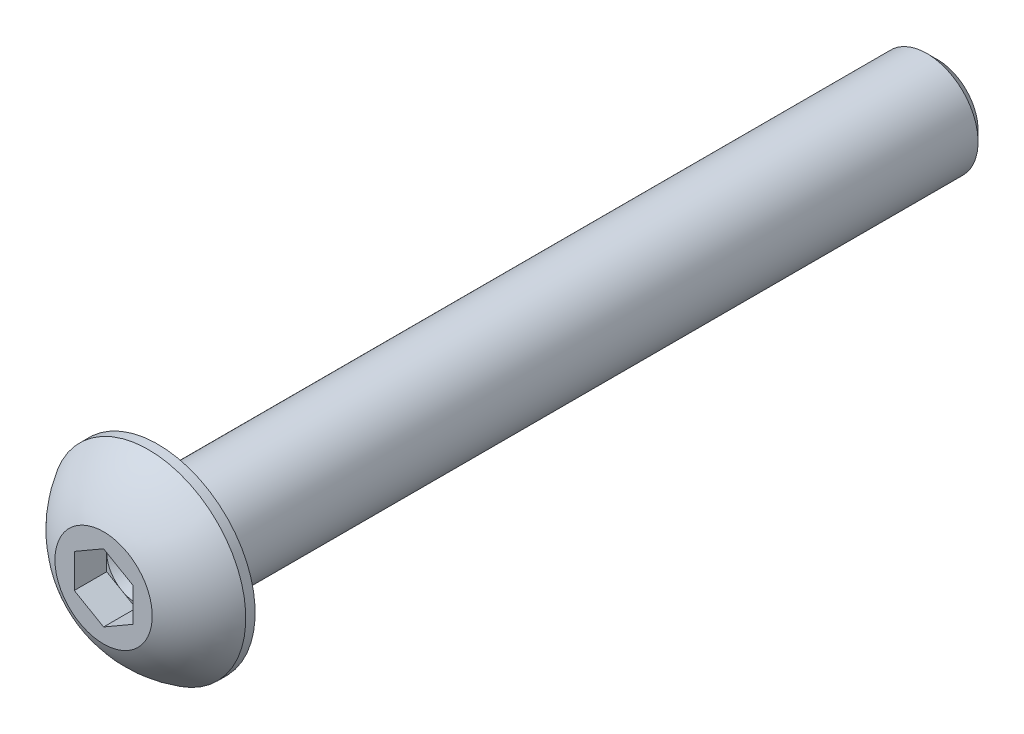
ISO-10303-21;
HEADER;
FILE_DESCRIPTION(('STEP AP214'),'2;1');
FILE_NAME('part.step','',(''),(''),'','','');
FILE_SCHEMA(('AUTOMOTIVE_DESIGN { 1 0 10303 214 1 1 1 1 }'));
ENDSEC;
DATA;
#1=APPLICATION_CONTEXT('core data for automotive mechanical design processes');
#2=APPLICATION_PROTOCOL_DEFINITION('international standard','automotive_design',2000,#1);
#3=PRODUCT_CONTEXT('',#1,'mechanical');
#4=PRODUCT('Part','Part','',(#3));
#5=PRODUCT_RELATED_PRODUCT_CATEGORY('part','',(#4));
#6=PRODUCT_DEFINITION_FORMATION('','',#4);
#7=PRODUCT_DEFINITION_CONTEXT('part definition',#1,'design');
#8=PRODUCT_DEFINITION('design','',#6,#7);
#9=PRODUCT_DEFINITION_SHAPE('','',#8);
#10=(LENGTH_UNIT() NAMED_UNIT(*) SI_UNIT(.MILLI.,.METRE.));
#11=(NAMED_UNIT(*) PLANE_ANGLE_UNIT() SI_UNIT($,.RADIAN.));
#12=(NAMED_UNIT(*) SI_UNIT($,.STERADIAN.) SOLID_ANGLE_UNIT());
#13=UNCERTAINTY_MEASURE_WITH_UNIT(LENGTH_MEASURE(1.E-05),#10,'distance_accuracy_value','');
#14=(GEOMETRIC_REPRESENTATION_CONTEXT(3) GLOBAL_UNCERTAINTY_ASSIGNED_CONTEXT((#13)) GLOBAL_UNIT_ASSIGNED_CONTEXT((#10,
#11,#12)) REPRESENTATION_CONTEXT('',''));
#15=CARTESIAN_POINT('',(0.,0.,0.));
#16=DIRECTION('',(0.,0.,1.));
#17=DIRECTION('',(1.,0.,0.));
#18=AXIS2_PLACEMENT_3D('',#15,#16,#17);
#19=CARTESIAN_POINT('',(0.,0.,-1.3208));
#20=DIRECTION('',(0.,0.,1.));
#21=DIRECTION('',(1.,0.,0.));
#22=AXIS2_PLACEMENT_3D('',#19,#20,#21);
#23=PLANE('',#22);
#24=CARTESIAN_POINT('',(0.,0.,-1.3208));
#25=DIRECTION('',(0.,0.,1.));
#26=DIRECTION('',(1.,0.,0.));
#27=AXIS2_PLACEMENT_3D('',#24,#25,#26);
#28=CIRCLE('',#27,1.1938);
#29=CARTESIAN_POINT('',(1.1938,0.,-1.3208));
#30=VERTEX_POINT('',#29);
#31=CARTESIAN_POINT('',(0.5969,1.03386112703786,-1.3208));
#32=VERTEX_POINT('',#31);
#33=EDGE_CURVE('E95',#30,#32,#28,.T.);
#34=ORIENTED_EDGE('',*,*,#33,.F.);
#35=DIRECTION('',(0.,-1.,0.));
#36=VECTOR('',#35,1.);
#37=CARTESIAN_POINT('',(1.1938,0.,-1.3208));
#38=LINE('',#37,#36);
#39=CARTESIAN_POINT('',(1.1938,0.689240751358576,-1.3208));
#40=VERTEX_POINT('',#39);
#41=EDGE_CURVE('E117',#40,#30,#38,.T.);
#42=ORIENTED_EDGE('',*,*,#41,.F.);
#43=DIRECTION('',(0.866025403784438,-0.5,0.));
#44=VECTOR('',#43,1.);
#45=CARTESIAN_POINT('',(0.5969,1.03386112703786,-1.3208));
#46=LINE('',#45,#44);
#47=EDGE_CURVE('E115',#32,#40,#46,.T.);
#48=ORIENTED_EDGE('',*,*,#47,.F.);
#49=EDGE_LOOP('',(#34,#42,#48));
#50=FACE_BOUND('',#49,.T.);
#51=ADVANCED_FACE('F17',(#50),#23,.T.);
#52=CARTESIAN_POINT('',(-0.5969,1.03386112703786,-1.3208));
#53=VERTEX_POINT('',#52);
#54=EDGE_CURVE('E97',#32,#53,#28,.T.);
#55=ORIENTED_EDGE('',*,*,#54,.F.);
#56=CARTESIAN_POINT('',(0.,1.37848150271715,-1.3208));
#57=VERTEX_POINT('',#56);
#58=EDGE_CURVE('E111',#57,#32,#46,.T.);
#59=ORIENTED_EDGE('',*,*,#58,.F.);
#60=DIRECTION('',(0.866025403784437,0.5,0.));
#61=VECTOR('',#60,1.);
#62=CARTESIAN_POINT('',(-0.5969,1.03386112703786,-1.3208));
#63=LINE('',#62,#61);
#64=EDGE_CURVE('E112',#53,#57,#63,.T.);
#65=ORIENTED_EDGE('',*,*,#64,.F.);
#66=EDGE_LOOP('',(#55,#59,#65));
#67=FACE_BOUND('',#66,.T.);
#68=ADVANCED_FACE('F109',(#67),#23,.T.);
#69=CARTESIAN_POINT('',(-1.1938,0.,-1.3208));
#70=VERTEX_POINT('',#69);
#71=EDGE_CURVE('E114',#53,#70,#28,.T.);
#72=ORIENTED_EDGE('',*,*,#71,.F.);
#73=CARTESIAN_POINT('',(-1.1938,0.689240751358572,-1.3208));
#74=VERTEX_POINT('',#73);
#75=EDGE_CURVE('E126',#74,#53,#63,.T.);
#76=ORIENTED_EDGE('',*,*,#75,.F.);
#77=DIRECTION('',(0.,1.,0.));
#78=VECTOR('',#77,1.);
#79=CARTESIAN_POINT('',(-1.1938,0.,-1.3208));
#80=LINE('',#79,#78);
#81=EDGE_CURVE('E129',#70,#74,#80,.T.);
#82=ORIENTED_EDGE('',*,*,#81,.F.);
#83=EDGE_LOOP('',(#72,#76,#82));
#84=FACE_BOUND('',#83,.T.);
#85=ADVANCED_FACE('F198',(#84),#23,.T.);
#86=CARTESIAN_POINT('',(-0.5969,-1.03386112703786,-1.3208));
#87=VERTEX_POINT('',#86);
#88=EDGE_CURVE('E224',#70,#87,#28,.T.);
#89=ORIENTED_EDGE('',*,*,#88,.F.);
#90=CARTESIAN_POINT('',(-1.1938,-0.689240751358575,-1.3208));
#91=VERTEX_POINT('',#90);
#92=EDGE_CURVE('E130',#91,#70,#80,.T.);
#93=ORIENTED_EDGE('',*,*,#92,.F.);
#94=DIRECTION('',(-0.866025403784438,0.5,0.));
#95=VECTOR('',#94,1.);
#96=CARTESIAN_POINT('',(-0.5969,-1.03386112703786,-1.3208));
#97=LINE('',#96,#95);
#98=EDGE_CURVE('E133',#87,#91,#97,.T.);
#99=ORIENTED_EDGE('',*,*,#98,.F.);
#100=EDGE_LOOP('',(#89,#93,#99));
#101=FACE_BOUND('',#100,.T.);
#102=ADVANCED_FACE('F211',(#101),#23,.T.);
#103=CARTESIAN_POINT('',(0.5969,-1.03386112703786,-1.3208));
#104=VERTEX_POINT('',#103);
#105=EDGE_CURVE('E32',#87,#104,#28,.T.);
#106=ORIENTED_EDGE('',*,*,#105,.F.);
#107=CARTESIAN_POINT('',(0.,-1.37848150271715,-1.3208));
#108=VERTEX_POINT('',#107);
#109=EDGE_CURVE('E134',#108,#87,#97,.T.);
#110=ORIENTED_EDGE('',*,*,#109,.F.);
#111=DIRECTION('',(-0.866025403784437,-0.5,0.));
#112=VECTOR('',#111,1.);
#113=CARTESIAN_POINT('',(0.5969,-1.03386112703786,-1.3208));
#114=LINE('',#113,#112);
#115=EDGE_CURVE('E137',#104,#108,#114,.T.);
#116=ORIENTED_EDGE('',*,*,#115,.F.);
#117=EDGE_LOOP('',(#106,#110,#116));
#118=FACE_BOUND('',#117,.T.);
#119=ADVANCED_FACE('F203',(#118),#23,.T.);
#120=CARTESIAN_POINT('',(-0.9906,0.,0.));
#121=DIRECTION('',(0.,0.,1.));
#122=DIRECTION('',(1.,0.,0.));
#123=AXIS2_PLACEMENT_3D('',#120,#121,#122);
#124=PLANE('',#123);
#125=CARTESIAN_POINT('',(0.,0.,0.));
#126=DIRECTION('',(0.,0.,-1.));
#127=DIRECTION('',(-1.,0.,0.));
#128=AXIS2_PLACEMENT_3D('',#125,#126,#127);
#129=CIRCLE('',#128,1.9812);
#130=CARTESIAN_POINT('',(-1.9812,0.,0.));
#131=VERTEX_POINT('',#130);
#132=EDGE_CURVE('E171',#131,#131,#129,.T.);
#133=ORIENTED_EDGE('',*,*,#132,.F.);
#134=EDGE_LOOP('',(#133));
#135=FACE_BOUND('',#134,.T.);
#136=DIRECTION('',(0.866025403784437,0.5,0.));
#137=VECTOR('',#136,1.);
#138=CARTESIAN_POINT('',(-0.5969,1.03386112703786,0.));
#139=LINE('',#138,#137);
#140=CARTESIAN_POINT('',(-1.1938,0.689240751358572,0.));
#141=VERTEX_POINT('',#140);
#142=CARTESIAN_POINT('',(0.,1.37848150271715,0.));
#143=VERTEX_POINT('',#142);
#144=EDGE_CURVE('E146',#141,#143,#139,.T.);
#145=ORIENTED_EDGE('',*,*,#144,.T.);
#146=DIRECTION('',(0.866025403784438,-0.5,0.));
#147=VECTOR('',#146,1.);
#148=CARTESIAN_POINT('',(0.5969,1.03386112703786,0.));
#149=LINE('',#148,#147);
#150=CARTESIAN_POINT('',(1.1938,0.689240751358576,0.));
#151=VERTEX_POINT('',#150);
#152=EDGE_CURVE('E104',#143,#151,#149,.T.);
#153=ORIENTED_EDGE('',*,*,#152,.T.);
#154=DIRECTION('',(0.,-1.,0.));
#155=VECTOR('',#154,1.);
#156=CARTESIAN_POINT('',(1.1938,0.,0.));
#157=LINE('',#156,#155);
#158=CARTESIAN_POINT('',(1.1938,-0.689240751358576,0.));
#159=VERTEX_POINT('',#158);
#160=EDGE_CURVE('E120',#151,#159,#157,.T.);
#161=ORIENTED_EDGE('',*,*,#160,.T.);
#162=DIRECTION('',(-0.866025403784437,-0.5,0.));
#163=VECTOR('',#162,1.);
#164=CARTESIAN_POINT('',(0.5969,-1.03386112703786,0.));
#165=LINE('',#164,#163);
#166=CARTESIAN_POINT('',(0.,-1.37848150271715,0.));
#167=VERTEX_POINT('',#166);
#168=EDGE_CURVE('E40',#159,#167,#165,.T.);
#169=ORIENTED_EDGE('',*,*,#168,.T.);
#170=DIRECTION('',(-0.866025403784438,0.5,0.));
#171=VECTOR('',#170,1.);
#172=CARTESIAN_POINT('',(-0.5969,-1.03386112703786,0.));
#173=LINE('',#172,#171);
#174=CARTESIAN_POINT('',(-1.1938,-0.689240751358575,0.));
#175=VERTEX_POINT('',#174);
#176=EDGE_CURVE('E152',#167,#175,#173,.T.);
#177=ORIENTED_EDGE('',*,*,#176,.T.);
#178=DIRECTION('',(0.,1.,0.));
#179=VECTOR('',#178,1.);
#180=CARTESIAN_POINT('',(-1.1938,0.,0.));
#181=LINE('',#180,#179);
#182=EDGE_CURVE('E149',#175,#141,#181,.T.);
#183=ORIENTED_EDGE('',*,*,#182,.T.);
#184=EDGE_LOOP('',(#145,#153,#161,#169,#177,#183));
#185=FACE_BOUND('',#184,.T.);
#186=ADVANCED_FACE('F210',(#135,#185),#124,.T.);
#187=CARTESIAN_POINT('',(0.,0.,1.48381805047393));
#188=DIRECTION('',(0.,0.,-1.));
#189=DIRECTION('',(-1.,0.,0.));
#190=AXIS2_PLACEMENT_3D('',#187,#188,#189);
#191=CYLINDRICAL_SURFACE('',#190,3.9624);
#192=CARTESIAN_POINT('',(0.,0.,-1.8288));
#193=DIRECTION('',(0.,0.,-1.));
#194=DIRECTION('',(-1.,0.,0.));
#195=AXIS2_PLACEMENT_3D('',#192,#193,#194);
#196=CIRCLE('',#195,3.9624);
#197=CARTESIAN_POINT('',(-3.9624,0.,-1.8288));
#198=VERTEX_POINT('',#197);
#199=EDGE_CURVE('E168',#198,#198,#196,.T.);
#200=ORIENTED_EDGE('',*,*,#199,.T.);
#201=EDGE_LOOP('',(#200));
#202=FACE_BOUND('',#201,.T.);
#203=CARTESIAN_POINT('',(0.,0.,-2.2098));
#204=DIRECTION('',(0.,0.,-1.));
#205=DIRECTION('',(-1.,0.,0.));
#206=AXIS2_PLACEMENT_3D('',#203,#204,#205);
#207=CIRCLE('',#206,3.9624);
#208=CARTESIAN_POINT('',(-3.9624,0.,-2.2098));
#209=VERTEX_POINT('',#208);
#210=EDGE_CURVE('E180',#209,#209,#207,.T.);
#211=ORIENTED_EDGE('',*,*,#210,.F.);
#212=EDGE_LOOP('',(#211));
#213=FACE_BOUND('',#212,.T.);
#214=ADVANCED_FACE('F217',(#202,#213),#191,.T.);
#215=CARTESIAN_POINT('',(-3.2131,0.,-2.2098));
#216=DIRECTION('',(0.,0.,-1.));
#217=DIRECTION('',(-1.,0.,0.));
#218=AXIS2_PLACEMENT_3D('',#215,#216,#217);
#219=PLANE('',#218);
#220=ORIENTED_EDGE('',*,*,#210,.T.);
#221=EDGE_LOOP('',(#220));
#222=FACE_BOUND('',#221,.T.);
#223=CARTESIAN_POINT('',(0.,0.,-2.2098));
#224=DIRECTION('',(0.,0.,-1.));
#225=DIRECTION('',(-1.,0.,0.));
#226=AXIS2_PLACEMENT_3D('',#223,#224,#225);
#227=CIRCLE('',#226,2.4638);
#228=CARTESIAN_POINT('',(-2.4638,0.,-2.2098));
#229=VERTEX_POINT('',#228);
#230=EDGE_CURVE('E177',#229,#229,#227,.T.);
#231=ORIENTED_EDGE('',*,*,#230,.F.);
#232=EDGE_LOOP('',(#231));
#233=FACE_BOUND('',#232,.T.);
#234=ADVANCED_FACE('F270',(#222,#233),#219,.T.);
#235=CARTESIAN_POINT('',(0.,0.,-2.5908));
#236=DIRECTION('',(0.,0.,-1.));
#237=DIRECTION('',(-1.,0.,0.));
#238=AXIS2_PLACEMENT_3D('',#235,#236,#237);
#239=TOROIDAL_SURFACE('',#238,2.4638,0.381);
#240=ORIENTED_EDGE('',*,*,#230,.T.);
#241=EDGE_LOOP('',(#240));
#242=FACE_BOUND('',#241,.T.);
#243=CARTESIAN_POINT('',(0.,0.,-2.5908));
#244=DIRECTION('',(0.,0.,-1.));
#245=DIRECTION('',(-1.,0.,0.));
#246=AXIS2_PLACEMENT_3D('',#243,#244,#245);
#247=CIRCLE('',#246,2.0828);
#248=CARTESIAN_POINT('',(-2.0828,0.,-2.5908));
#249=VERTEX_POINT('',#248);
#250=EDGE_CURVE('E174',#249,#249,#247,.T.);
#251=ORIENTED_EDGE('',*,*,#250,.F.);
#252=EDGE_LOOP('',(#251));
#253=FACE_BOUND('',#252,.T.);
#254=ADVANCED_FACE('F266',(#242,#253),#239,.F.);
#255=CARTESIAN_POINT('',(0.,0.,1.48381805047393));
#256=DIRECTION('',(0.,0.,-1.));
#257=DIRECTION('',(-1.,0.,0.));
#258=AXIS2_PLACEMENT_3D('',#255,#256,#257);
#259=CYLINDRICAL_SURFACE('',#258,2.0828);
#260=CARTESIAN_POINT('',(0.,0.,-33.53085761938));
#261=DIRECTION('',(0.,0.,-1.));
#262=DIRECTION('',(-1.,0.,0.));
#263=AXIS2_PLACEMENT_3D('',#260,#261,#262);
#264=CIRCLE('',#263,2.0828);
#265=CARTESIAN_POINT('',(-2.0828,0.,-33.53085761938));
#266=VERTEX_POINT('',#265);
#267=EDGE_CURVE('E11',#266,#266,#264,.F.);
#268=ORIENTED_EDGE('',*,*,#267,.T.);
#269=EDGE_LOOP('',(#268));
#270=FACE_BOUND('',#269,.T.);
#271=ORIENTED_EDGE('',*,*,#250,.T.);
#272=EDGE_LOOP('',(#271));
#273=FACE_BOUND('',#272,.T.);
#274=ADVANCED_FACE('F263',(#270,#273),#259,.T.);
#275=CARTESIAN_POINT('',(-1.0414,0.,-33.9598));
#276=DIRECTION('',(0.,0.,-1.));
#277=DIRECTION('',(-1.,0.,0.));
#278=AXIS2_PLACEMENT_3D('',#275,#276,#277);
#279=PLANE('',#278);
#280=CARTESIAN_POINT('',(0.,0.,-33.9598));
#281=DIRECTION('',(0.,0.,-1.));
#282=DIRECTION('',(-1.,0.,0.));
#283=AXIS2_PLACEMENT_3D('',#280,#281,#282);
#284=CIRCLE('',#283,1.65385761938);
#285=CARTESIAN_POINT('',(-1.65385761938,0.,-33.9598));
#286=VERTEX_POINT('',#285);
#287=EDGE_CURVE('E25',#286,#286,#284,.T.);
#288=ORIENTED_EDGE('',*,*,#287,.T.);
#289=EDGE_LOOP('',(#288));
#290=FACE_BOUND('',#289,.T.);
#291=ADVANCED_FACE('F185',(#290),#279,.T.);
#292=CARTESIAN_POINT('',(0.,0.,-4.13385));
#293=DIRECTION('',(0.,0.,-1.));
#294=DIRECTION('',(-1.,0.,0.));
#295=AXIS2_PLACEMENT_3D('',#292,#293,#294);
#296=SPHERICAL_SURFACE('',#295,4.58408870578439);
#297=CARTESIAN_POINT('',(-3.9624,0.,-1.8288));
#298=CARTESIAN_POINT('',(-3.94806555004249,0.,-1.80415889596803));
#299=CARTESIAN_POINT('',(-3.93350118989005,0.,-1.77965153901308));
#300=CARTESIAN_POINT('',(-3.90391784301183,0.,-1.73091277312732));
#301=CARTESIAN_POINT('',(-3.88889885628605,0.,-1.70668136419653));
#302=CARTESIAN_POINT('',(-3.85841145007764,0.,-1.65850294822928));
#303=CARTESIAN_POINT('',(-3.84294303059502,0.,-1.63455594119281));
#304=CARTESIAN_POINT('',(-3.8115621515089,0.,-1.58695465816593));
#305=CARTESIAN_POINT('',(-3.79564969190541,0.,-1.56330038217551));
#306=CARTESIAN_POINT('',(-3.76338626839824,0.,-1.51629279540493));
#307=CARTESIAN_POINT('',(-3.74703530449455,0.,-1.49293948462476));
#308=CARTESIAN_POINT('',(-3.71390056387007,0.,-1.44654195584239));
#309=CARTESIAN_POINT('',(-3.69711678714927,0.,-1.42349773784017));
#310=CARTESIAN_POINT('',(-3.66312226219548,0.,-1.37772641509887));
#311=CARTESIAN_POINT('',(-3.6459115139625,0.,-1.35499931035979));
#312=CARTESIAN_POINT('',(-3.61106903611232,0.,-1.30987012412818));
#313=CARTESIAN_POINT('',(-3.59343730649512,0.,-1.28746804263567));
#314=CARTESIAN_POINT('',(-3.55775900246558,0.,-1.2429966997941));
#315=CARTESIAN_POINT('',(-3.53971242805323,0.,-1.22092743844506));
#316=CARTESIAN_POINT('',(-3.50321071542199,0.,-1.17712941694205));
#317=CARTESIAN_POINT('',(-3.48475557720311,0.,-1.15540065678809));
#318=CARTESIAN_POINT('',(-3.44744316014101,0.,-1.11229120022037));
#319=CARTESIAN_POINT('',(-3.4285858812978,0.,-1.0909105038066));
#320=CARTESIAN_POINT('',(-3.39047574613265,0.,-1.04850461612249));
#321=CARTESIAN_POINT('',(-3.37122288981071,0.,-1.02747942485214));
#322=CARTESIAN_POINT('',(-3.33232830051141,0.,-0.985791865127185));
#323=CARTESIAN_POINT('',(-3.31268656753406,0.,-0.965129496672575));
#324=CARTESIAN_POINT('',(-3.27302106109312,0.,-0.924174773973387));
#325=CARTESIAN_POINT('',(-3.25299728762955,0.,-0.903882419728808));
#326=CARTESIAN_POINT('',(-3.21257466935193,0.,-0.863674788063108));
#327=CARTESIAN_POINT('',(-3.19217582453788,0.,-0.843759510641986));
#328=CARTESIAN_POINT('',(-3.15101016323603,0.,-0.80431296399764));
#329=CARTESIAN_POINT('',(-3.13024334674824,0.,-0.784781694774417));
#330=CARTESIAN_POINT('',(-3.08834896984561,0.,-0.746109962248918));
#331=CARTESIAN_POINT('',(-3.06722140943079,0.,-0.726969498946642));
#332=CARTESIAN_POINT('',(-3.02461289797525,0.,-0.68908603996879));
#333=CARTESIAN_POINT('',(-3.00313194693455,0.,-0.670343044293214));
#334=CARTESIAN_POINT('',(-2.95982413052356,0.,-0.63326104393866));
#335=CARTESIAN_POINT('',(-2.93799726515328,0.,-0.614922039259682));
#336=CARTESIAN_POINT('',(-2.89400521677254,0.,-0.578654403661948));
#337=CARTESIAN_POINT('',(-2.87184003376209,0.,-0.560725772743191));
#338=CARTESIAN_POINT('',(-2.8271790645395,0.,-0.525285124601797));
#339=CARTESIAN_POINT('',(-2.80468327832737,0.,-0.507773107379159));
#340=CARTESIAN_POINT('',(-2.75936893220414,0.,-0.473171781566304));
#341=CARTESIAN_POINT('',(-2.73655037229303,0.,-0.456082472976087));
#342=CARTESIAN_POINT('',(-2.69059842061354,0.,-0.422332512243877));
#343=CARTESIAN_POINT('',(-2.66746502884515,0.,-0.405671860101884));
#344=CARTESIAN_POINT('',(-2.62089146486841,0.,-0.372785010889838));
#345=CARTESIAN_POINT('',(-2.59745129266007,0.,-0.356558813819785));
#346=CARTESIAN_POINT('',(-2.55027232599135,0.,-0.324546522170651));
#347=CARTESIAN_POINT('',(-2.52653353153099,0.,-0.30876042759157));
#348=CARTESIAN_POINT('',(-2.47876558248781,0.,-0.277633835152381));
#349=CARTESIAN_POINT('',(-2.454736427905,0.,-0.262293337292275));
#350=CARTESIAN_POINT('',(-2.4063961217736,0.,-0.232063277493399));
#351=CARTESIAN_POINT('',(-2.382084970225,0.,-0.21717371555463));
#352=CARTESIAN_POINT('',(-2.33318913158055,0.,-0.187850709627219));
#353=CARTESIAN_POINT('',(-2.30860444448469,0.,-0.173417265638577));
#354=CARTESIAN_POINT('',(-2.25917009093804,0.,-0.145011519744089));
#355=CARTESIAN_POINT('',(-2.23432042448725,0.,-0.131039217838244));
#356=CARTESIAN_POINT('',(-2.18436476224591,0.,-0.103560616562858));
#357=CARTESIAN_POINT('',(-2.15925876645535,0.,-0.0900543171933176));
#358=CARTESIAN_POINT('',(-2.10879917879722,0.,-0.0635124311299285));
#359=CARTESIAN_POINT('',(-2.08344558692965,0.,-0.0504768444360801));
#360=CARTESIAN_POINT('',(-2.03249964882003,0.,-0.0248808857176731));
#361=CARTESIAN_POINT('',(-2.00690730257799,0.,-0.0123205136931147));
#362=CARTESIAN_POINT('',(-1.9812,0.,0.));
#363=B_SPLINE_CURVE_WITH_KNOTS('',3,(#297,#298,#299,#300,#301,#302,#303,#304,#305,#306,#307,
#308,#309,#310,#311,#312,#313,#314,#315,#316,#317,#318,#319,#320,#321,#322,#323,#324,#325,#326,
#327,#328,#329,#330,#331,#332,#333,#334,#335,#336,#337,#338,#339,#340,#341,#342,#343,#344,#345,
#346,#347,#348,#349,#350,#351,#352,#353,#354,#355,#356,#357,#358,#359,#360,#361,#362),
.UNSPECIFIED.,.F.,.F.,(4,2,2,2,2,2,2,2,2,2,2,2,2,2,2,2,2,2,2,2,2,2,2,2,2,2,2,2,2,2,2,2,4),(0.,
0.0855203585635449,0.17104071712709,0.256561075690636,0.342081434254181,0.427601792817726,
0.513122151381271,0.598642509944817,0.684162868508362,0.769683227071907,0.855203585635452,
0.940723944198998,1.02624430276254,1.11176466132609,1.19728501988963,1.28280537845318,
1.36832573701672,1.45384609558027,1.53936645414382,1.62488681270736,1.71040717127091,
1.79592752983445,1.881447888398,1.96696824696154,2.05248860552509,2.13800896408863,
2.22352932265218,2.30904968121572,2.39457003977927,2.48009039834281,2.56561075690636,
2.6511311154699,2.73665147403345),.UNSPECIFIED.);
#364=EDGE_CURVE('BSEAM257',#198,#131,#363,.T.);
#365=ORIENTED_EDGE('',*,*,#199,.F.);
#366=ORIENTED_EDGE('',*,*,#132,.T.);
#367=ORIENTED_EDGE('',*,*,#364,.T.);
#368=ORIENTED_EDGE('',*,*,#364,.F.);
#369=EDGE_LOOP('',(#365,#367,#366,#368));
#370=FACE_BOUND('',#369,.T.);
#371=ADVANCED_FACE('F257',(#370),#296,.T.);
#372=CARTESIAN_POINT('',(0.5969,1.03386112703786,-1.3208));
#373=DIRECTION('',(-0.5,-0.866025403784439,0.));
#374=DIRECTION('',(0.866025403784438,-0.5,0.));
#375=AXIS2_PLACEMENT_3D('',#372,#373,#374);
#376=PLANE('',#375);
#377=ORIENTED_EDGE('',*,*,#152,.F.);
#378=DIRECTION('',(0.,0.,1.));
#379=VECTOR('',#378,1.);
#380=CARTESIAN_POINT('',(0.,1.37848150271715,-1.3208));
#381=LINE('',#380,#379);
#382=EDGE_CURVE('E125',#57,#143,#381,.T.);
#383=ORIENTED_EDGE('',*,*,#382,.F.);
#384=ORIENTED_EDGE('',*,*,#58,.T.);
#385=ORIENTED_EDGE('',*,*,#47,.T.);
#386=DIRECTION('',(0.,0.,1.));
#387=VECTOR('',#386,1.);
#388=CARTESIAN_POINT('',(1.1938,0.689240751358576,-1.3208));
#389=LINE('',#388,#387);
#390=EDGE_CURVE('E143',#40,#151,#389,.T.);
#391=ORIENTED_EDGE('',*,*,#390,.T.);
#392=EDGE_LOOP('',(#377,#383,#384,#385,#391));
#393=FACE_BOUND('',#392,.T.);
#394=ADVANCED_FACE('F124',(#393),#376,.T.);
#395=CARTESIAN_POINT('',(-0.5969,1.03386112703786,-1.3208));
#396=DIRECTION('',(0.5,-0.866025403784437,0.));
#397=DIRECTION('',(0.866025403784437,0.5,0.));
#398=AXIS2_PLACEMENT_3D('',#395,#396,#397);
#399=PLANE('',#398);
#400=ORIENTED_EDGE('',*,*,#144,.F.);
#401=DIRECTION('',(0.,0.,1.));
#402=VECTOR('',#401,1.);
#403=CARTESIAN_POINT('',(-1.1938,0.689240751358572,-1.3208));
#404=LINE('',#403,#402);
#405=EDGE_CURVE('E165',#74,#141,#404,.T.);
#406=ORIENTED_EDGE('',*,*,#405,.F.);
#407=ORIENTED_EDGE('',*,*,#75,.T.);
#408=ORIENTED_EDGE('',*,*,#64,.T.);
#409=ORIENTED_EDGE('',*,*,#382,.T.);
#410=EDGE_LOOP('',(#400,#406,#407,#408,#409));
#411=FACE_BOUND('',#410,.T.);
#412=ADVANCED_FACE('F240',(#411),#399,.T.);
#413=CARTESIAN_POINT('',(-1.1938,0.,-1.3208));
#414=DIRECTION('',(1.,0.,0.));
#415=DIRECTION('',(0.,0.,-1.));
#416=AXIS2_PLACEMENT_3D('',#413,#414,#415);
#417=PLANE('',#416);
#418=ORIENTED_EDGE('',*,*,#182,.F.);
#419=DIRECTION('',(0.,0.,1.));
#420=VECTOR('',#419,1.);
#421=CARTESIAN_POINT('',(-1.1938,-0.689240751358575,-1.3208));
#422=LINE('',#421,#420);
#423=EDGE_CURVE('E163',#91,#175,#422,.T.);
#424=ORIENTED_EDGE('',*,*,#423,.F.);
#425=ORIENTED_EDGE('',*,*,#92,.T.);
#426=ORIENTED_EDGE('',*,*,#81,.T.);
#427=ORIENTED_EDGE('',*,*,#405,.T.);
#428=EDGE_LOOP('',(#418,#424,#425,#426,#427));
#429=FACE_BOUND('',#428,.T.);
#430=ADVANCED_FACE('F244',(#429),#417,.T.);
#431=CARTESIAN_POINT('',(-0.5969,-1.03386112703786,-1.3208));
#432=DIRECTION('',(0.5,0.866025403784439,0.));
#433=DIRECTION('',(-0.866025403784439,0.5,0.));
#434=AXIS2_PLACEMENT_3D('',#431,#432,#433);
#435=PLANE('',#434);
#436=ORIENTED_EDGE('',*,*,#176,.F.);
#437=DIRECTION('',(0.,0.,1.));
#438=VECTOR('',#437,1.);
#439=CARTESIAN_POINT('',(0.,-1.37848150271715,-1.3208));
#440=LINE('',#439,#438);
#441=EDGE_CURVE('E161',#108,#167,#440,.T.);
#442=ORIENTED_EDGE('',*,*,#441,.F.);
#443=ORIENTED_EDGE('',*,*,#109,.T.);
#444=ORIENTED_EDGE('',*,*,#98,.T.);
#445=ORIENTED_EDGE('',*,*,#423,.T.);
#446=EDGE_LOOP('',(#436,#442,#443,#444,#445));
#447=FACE_BOUND('',#446,.T.);
#448=ADVANCED_FACE('F232',(#447),#435,.T.);
#449=CARTESIAN_POINT('',(0.5969,-1.03386112703786,-1.3208));
#450=DIRECTION('',(-0.5,0.866025403784437,0.));
#451=DIRECTION('',(-0.866025403784437,-0.5,0.));
#452=AXIS2_PLACEMENT_3D('',#449,#450,#451);
#453=PLANE('',#452);
#454=ORIENTED_EDGE('',*,*,#168,.F.);
#455=DIRECTION('',(0.,0.,1.));
#456=VECTOR('',#455,1.);
#457=CARTESIAN_POINT('',(1.1938,-0.689240751358576,-1.3208));
#458=LINE('',#457,#456);
#459=CARTESIAN_POINT('',(1.1938,-0.689240751358576,-1.3208));
#460=VERTEX_POINT('',#459);
#461=EDGE_CURVE('E159',#460,#159,#458,.T.);
#462=ORIENTED_EDGE('',*,*,#461,.F.);
#463=EDGE_CURVE('E138',#460,#104,#114,.T.);
#464=ORIENTED_EDGE('',*,*,#463,.T.);
#465=ORIENTED_EDGE('',*,*,#115,.T.);
#466=ORIENTED_EDGE('',*,*,#441,.T.);
#467=EDGE_LOOP('',(#454,#462,#464,#465,#466));
#468=FACE_BOUND('',#467,.T.);
#469=ADVANCED_FACE('F207',(#468),#453,.T.);
#470=CARTESIAN_POINT('',(1.1938,0.,-1.3208));
#471=DIRECTION('',(-1.,0.,0.));
#472=DIRECTION('',(0.,0.,1.));
#473=AXIS2_PLACEMENT_3D('',#470,#471,#472);
#474=PLANE('',#473);
#475=ORIENTED_EDGE('',*,*,#160,.F.);
#476=ORIENTED_EDGE('',*,*,#390,.F.);
#477=ORIENTED_EDGE('',*,*,#41,.T.);
#478=EDGE_CURVE('E141',#30,#460,#38,.T.);
#479=ORIENTED_EDGE('',*,*,#478,.T.);
#480=ORIENTED_EDGE('',*,*,#461,.T.);
#481=EDGE_LOOP('',(#475,#476,#477,#479,#480));
#482=FACE_BOUND('',#481,.T.);
#483=ADVANCED_FACE('F201',(#482),#474,.T.);
#484=EDGE_CURVE('E99',#104,#30,#28,.T.);
#485=ORIENTED_EDGE('',*,*,#484,.F.);
#486=ORIENTED_EDGE('',*,*,#463,.F.);
#487=ORIENTED_EDGE('',*,*,#478,.F.);
#488=EDGE_LOOP('',(#485,#486,#487));
#489=FACE_BOUND('',#488,.T.);
#490=ADVANCED_FACE('F92',(#489),#23,.T.);
#491=CARTESIAN_POINT('',(0.,0.,-1.3208));
#492=DIRECTION('',(0.,0.,1.));
#493=DIRECTION('',(1.,0.,0.));
#494=AXIS2_PLACEMENT_3D('',#491,#492,#493);
#495=CONICAL_SURFACE('',#494,1.1938,1.0471975511966);
#496=CARTESIAN_POINT('',(0.,0.,-2.01004075135857));
#497=VERTEX_POINT('',#496);
#498=VERTEX_LOOP('',#497);
#499=FACE_BOUND('',#498,.T.);
#500=ORIENTED_EDGE('',*,*,#33,.T.);
#501=ORIENTED_EDGE('',*,*,#54,.T.);
#502=ORIENTED_EDGE('',*,*,#71,.T.);
#503=ORIENTED_EDGE('',*,*,#88,.T.);
#504=ORIENTED_EDGE('',*,*,#105,.T.);
#505=ORIENTED_EDGE('',*,*,#484,.T.);
#506=EDGE_LOOP('',(#500,#501,#502,#503,#504,#505));
#507=FACE_BOUND('',#506,.T.);
#508=ADVANCED_FACE('F90',(#499,#507),#495,.F.);
#509=CARTESIAN_POINT('',(0.,0.,-33.9598));
#510=DIRECTION('',(0.,0.,1.));
#511=DIRECTION('',(1.,0.,0.));
#512=AXIS2_PLACEMENT_3D('',#509,#510,#511);
#513=CONICAL_SURFACE('',#512,1.65385761938,0.785398163397446);
#514=ORIENTED_EDGE('',*,*,#267,.F.);
#515=EDGE_LOOP('',(#514));
#516=FACE_BOUND('',#515,.T.);
#517=ORIENTED_EDGE('',*,*,#287,.F.);
#518=EDGE_LOOP('',(#517));
#519=FACE_BOUND('',#518,.T.);
#520=ADVANCED_FACE('F19',(#516,#519),#513,.T.);
#521=CLOSED_SHELL('',(#51,#68,#85,#102,#119,#186,#214,#234,#254,#274,#291,#371,#394,#412,#430,
#448,#469,#483,#490,#508,#520));
#522=MANIFOLD_SOLID_BREP('B1',#521);
#523=ADVANCED_BREP_SHAPE_REPRESENTATION('',(#18,#522),#14);
#524=SHAPE_DEFINITION_REPRESENTATION(#9,#523);
ENDSEC;
END-ISO-10303-21;
